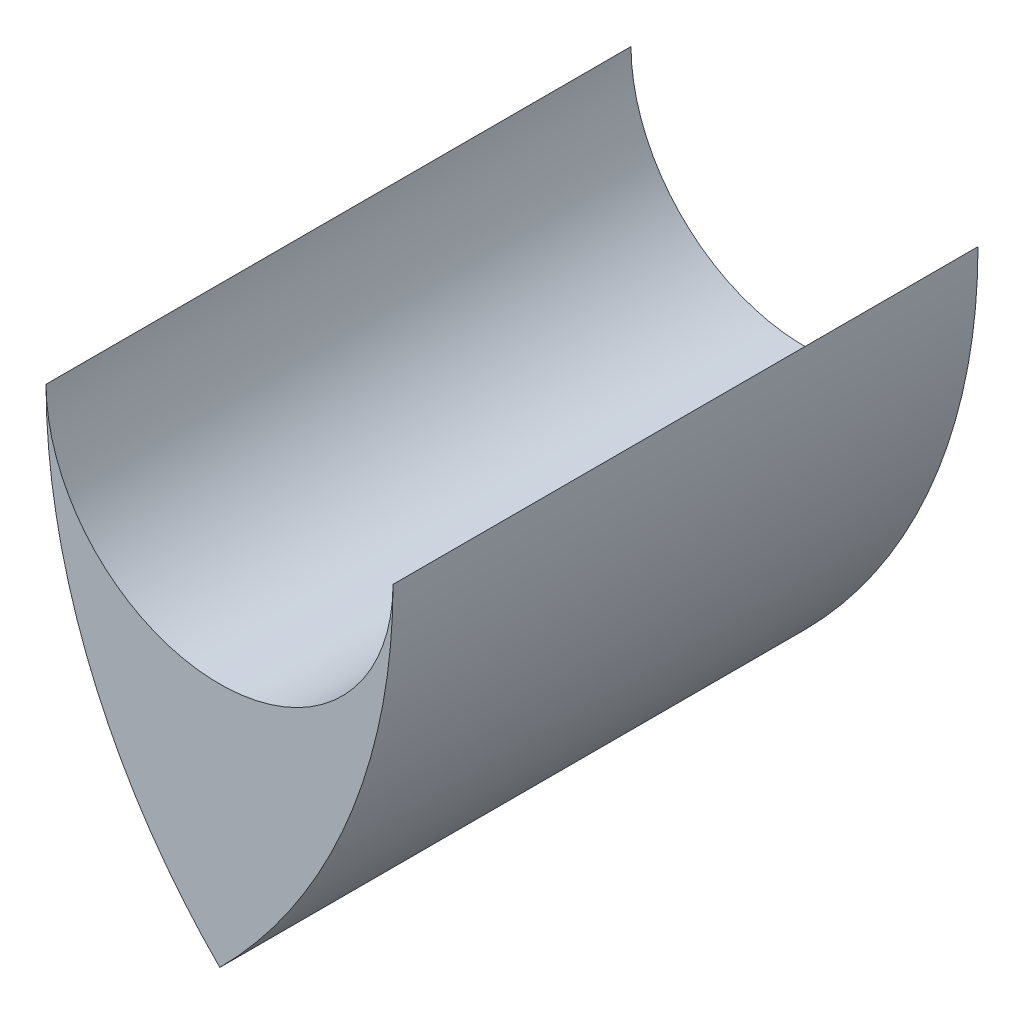
ISO-10303-21;
HEADER;
FILE_DESCRIPTION(('STEP AP214'),'2;1');
FILE_NAME('part.step','',(''),(''),'','','');
FILE_SCHEMA(('AUTOMOTIVE_DESIGN { 1 0 10303 214 1 1 1 1 }'));
ENDSEC;
DATA;
#1=APPLICATION_CONTEXT('core data for automotive mechanical design processes');
#2=APPLICATION_PROTOCOL_DEFINITION('international standard','automotive_design',2000,#1);
#3=PRODUCT_CONTEXT('',#1,'mechanical');
#4=PRODUCT('Part','Part','',(#3));
#5=PRODUCT_RELATED_PRODUCT_CATEGORY('part','',(#4));
#6=PRODUCT_DEFINITION_FORMATION('','',#4);
#7=PRODUCT_DEFINITION_CONTEXT('part definition',#1,'design');
#8=PRODUCT_DEFINITION('design','',#6,#7);
#9=PRODUCT_DEFINITION_SHAPE('','',#8);
#10=(LENGTH_UNIT() NAMED_UNIT(*) SI_UNIT(.MILLI.,.METRE.));
#11=(NAMED_UNIT(*) PLANE_ANGLE_UNIT() SI_UNIT($,.RADIAN.));
#12=(NAMED_UNIT(*) SI_UNIT($,.STERADIAN.) SOLID_ANGLE_UNIT());
#13=UNCERTAINTY_MEASURE_WITH_UNIT(LENGTH_MEASURE(1.E-05),#10,'distance_accuracy_value','');
#14=(GEOMETRIC_REPRESENTATION_CONTEXT(3) GLOBAL_UNCERTAINTY_ASSIGNED_CONTEXT((#13)) GLOBAL_UNIT_ASSIGNED_CONTEXT((#10,
#11,#12)) REPRESENTATION_CONTEXT('',''));
#15=CARTESIAN_POINT('',(0.,0.,0.));
#16=DIRECTION('',(0.,0.,1.));
#17=DIRECTION('',(1.,0.,0.));
#18=AXIS2_PLACEMENT_3D('',#15,#16,#17);
#19=CARTESIAN_POINT('',(-62.1568004285692,-0.0397489208692342,12.));
#20=DIRECTION('',(0.,0.,1.));
#21=DIRECTION('',(1.,0.,0.));
#22=AXIS2_PLACEMENT_3D('',#19,#20,#21);
#23=CYLINDRICAL_SURFACE('',#22,22.279896339874);
#24=CARTESIAN_POINT('',(-62.1568004285692,-0.0397489208692342,14.));
#25=DIRECTION('',(0.,0.,1.));
#26=DIRECTION('',(1.,0.,0.));
#27=AXIS2_PLACEMENT_3D('',#24,#25,#26);
#28=CIRCLE('',#27,22.279896339874);
#29=CARTESIAN_POINT('',(-46.39203326944,-15.7835063292509,14.));
#30=VERTEX_POINT('',#29);
#31=CARTESIAN_POINT('',(-39.8769055684301,-0.0478690612494685,14.));
#32=VERTEX_POINT('',#31);
#33=EDGE_CURVE('E60',#30,#32,#28,.T.);
#34=ORIENTED_EDGE('',*,*,#33,.F.);
#35=DIRECTION('',(0.,0.,1.));
#36=VECTOR('',#35,1.);
#37=CARTESIAN_POINT('',(-46.39203326944,-15.7835063292509,12.));
#38=LINE('',#37,#36);
#39=CARTESIAN_POINT('',(-46.39203326944,-15.7835063292509,-8.));
#40=VERTEX_POINT('',#39);
#41=EDGE_CURVE('E33',#40,#30,#38,.T.);
#42=ORIENTED_EDGE('',*,*,#41,.F.);
#43=CARTESIAN_POINT('',(-62.1568004285692,-0.0397489208692342,-8.));
#44=DIRECTION('',(0.,0.,1.));
#45=DIRECTION('',(1.,0.,0.));
#46=AXIS2_PLACEMENT_3D('',#43,#44,#45);
#47=CIRCLE('',#46,22.279896339874);
#48=CARTESIAN_POINT('',(-39.8769055684301,-0.0478690612494685,-8.));
#49=VERTEX_POINT('',#48);
#50=EDGE_CURVE('E63',#40,#49,#47,.T.);
#51=ORIENTED_EDGE('',*,*,#50,.T.);
#52=DIRECTION('',(0.,0.,1.));
#53=VECTOR('',#52,1.);
#54=CARTESIAN_POINT('',(-39.8769055684301,-0.0478690612499869,-8.));
#55=LINE('',#54,#53);
#56=EDGE_CURVE('E10',#49,#32,#55,.T.);
#57=ORIENTED_EDGE('',*,*,#56,.T.);
#58=EDGE_LOOP('',(#34,#42,#51,#57));
#59=FACE_BOUND('',#58,.T.);
#60=ADVANCED_FACE('F16',(#59),#23,.T.);
#61=CARTESIAN_POINT('',(-46.4025381448138,-0.0292440454954593,12.));
#62=DIRECTION('',(0.,0.,1.));
#63=DIRECTION('',(1.,0.,0.));
#64=AXIS2_PLACEMENT_3D('',#61,#62,#63);
#65=CYLINDRICAL_SURFACE('',#64,6.52565915545479);
#66=CARTESIAN_POINT('',(-46.4025381448138,-0.0292440454954593,14.));
#67=DIRECTION('',(0.,0.,1.));
#68=DIRECTION('',(1.,0.,0.));
#69=AXIS2_PLACEMENT_3D('',#66,#67,#68);
#70=CIRCLE('',#69,6.52565915545479);
#71=CARTESIAN_POINT('',(-52.9281400802387,-0.0565715691515762,14.));
#72=VERTEX_POINT('',#71);
#73=EDGE_CURVE('E61',#72,#32,#70,.T.);
#74=ORIENTED_EDGE('',*,*,#73,.T.);
#75=ORIENTED_EDGE('',*,*,#56,.F.);
#76=CARTESIAN_POINT('',(-46.4025381448138,-0.0292440454954593,-8.));
#77=DIRECTION('',(0.,0.,1.));
#78=DIRECTION('',(1.,0.,0.));
#79=AXIS2_PLACEMENT_3D('',#76,#77,#78);
#80=CIRCLE('',#79,6.52565915545479);
#81=CARTESIAN_POINT('',(-52.9281400802387,-0.0565715691510601,-8.));
#82=VERTEX_POINT('',#81);
#83=EDGE_CURVE('E74',#82,#49,#80,.T.);
#84=ORIENTED_EDGE('',*,*,#83,.F.);
#85=DIRECTION('',(0.,0.,1.));
#86=VECTOR('',#85,1.);
#87=CARTESIAN_POINT('',(-52.9281400802387,-0.0565715691507914,-8.));
#88=LINE('',#87,#86);
#89=EDGE_CURVE('E20',#82,#72,#88,.T.);
#90=ORIENTED_EDGE('',*,*,#89,.T.);
#91=EDGE_LOOP('',(#74,#75,#84,#90));
#92=FACE_BOUND('',#91,.T.);
#93=ADVANCED_FACE('F87',(#92),#65,.F.);
#94=CARTESIAN_POINT('',(-30.6482758610584,-0.018739170121674,12.));
#95=DIRECTION('',(0.,0.,1.));
#96=DIRECTION('',(1.,0.,0.));
#97=AXIS2_PLACEMENT_3D('',#94,#95,#96);
#98=CYLINDRICAL_SURFACE('',#97,22.279896339874);
#99=CARTESIAN_POINT('',(-30.6482758610584,-0.018739170121674,14.));
#100=DIRECTION('',(0.,0.,1.));
#101=DIRECTION('',(1.,0.,0.));
#102=AXIS2_PLACEMENT_3D('',#99,#100,#101);
#103=CIRCLE('',#102,22.279896339874);
#104=EDGE_CURVE('E51',#72,#30,#103,.T.);
#105=ORIENTED_EDGE('',*,*,#104,.F.);
#106=ORIENTED_EDGE('',*,*,#89,.F.);
#107=CARTESIAN_POINT('',(-30.6482758610584,-0.018739170121674,-8.));
#108=DIRECTION('',(0.,0.,1.));
#109=DIRECTION('',(1.,0.,0.));
#110=AXIS2_PLACEMENT_3D('',#107,#108,#109);
#111=CIRCLE('',#110,22.279896339874);
#112=EDGE_CURVE('E54',#82,#40,#111,.T.);
#113=ORIENTED_EDGE('',*,*,#112,.T.);
#114=ORIENTED_EDGE('',*,*,#41,.T.);
#115=EDGE_LOOP('',(#105,#106,#113,#114));
#116=FACE_BOUND('',#115,.T.);
#117=ADVANCED_FACE('F50',(#116),#98,.T.);
#118=CARTESIAN_POINT('',(0.,0.,-8.));
#119=DIRECTION('',(0.,0.,1.));
#120=DIRECTION('',(0.,-1.,0.));
#121=AXIS2_PLACEMENT_3D('',#118,#119,#120);
#122=PLANE('',#121);
#123=ORIENTED_EDGE('',*,*,#50,.F.);
#124=ORIENTED_EDGE('',*,*,#112,.F.);
#125=ORIENTED_EDGE('',*,*,#83,.T.);
#126=EDGE_LOOP('',(#123,#124,#125));
#127=FACE_BOUND('',#126,.T.);
#128=ADVANCED_FACE('F18',(#127),#122,.F.);
#129=CARTESIAN_POINT('',(0.,0.,14.));
#130=DIRECTION('',(0.,0.,1.));
#131=DIRECTION('',(0.,-1.,0.));
#132=AXIS2_PLACEMENT_3D('',#129,#130,#131);
#133=PLANE('',#132);
#134=ORIENTED_EDGE('',*,*,#33,.T.);
#135=ORIENTED_EDGE('',*,*,#73,.F.);
#136=ORIENTED_EDGE('',*,*,#104,.T.);
#137=EDGE_LOOP('',(#134,#135,#136));
#138=FACE_BOUND('',#137,.T.);
#139=ADVANCED_FACE('F59',(#138),#133,.T.);
#140=CLOSED_SHELL('',(#60,#93,#117,#128,#139));
#141=MANIFOLD_SOLID_BREP('B1',#140);
#142=ADVANCED_BREP_SHAPE_REPRESENTATION('',(#18,#141),#14);
#143=SHAPE_DEFINITION_REPRESENTATION(#9,#142);
ENDSEC;
END-ISO-10303-21;
